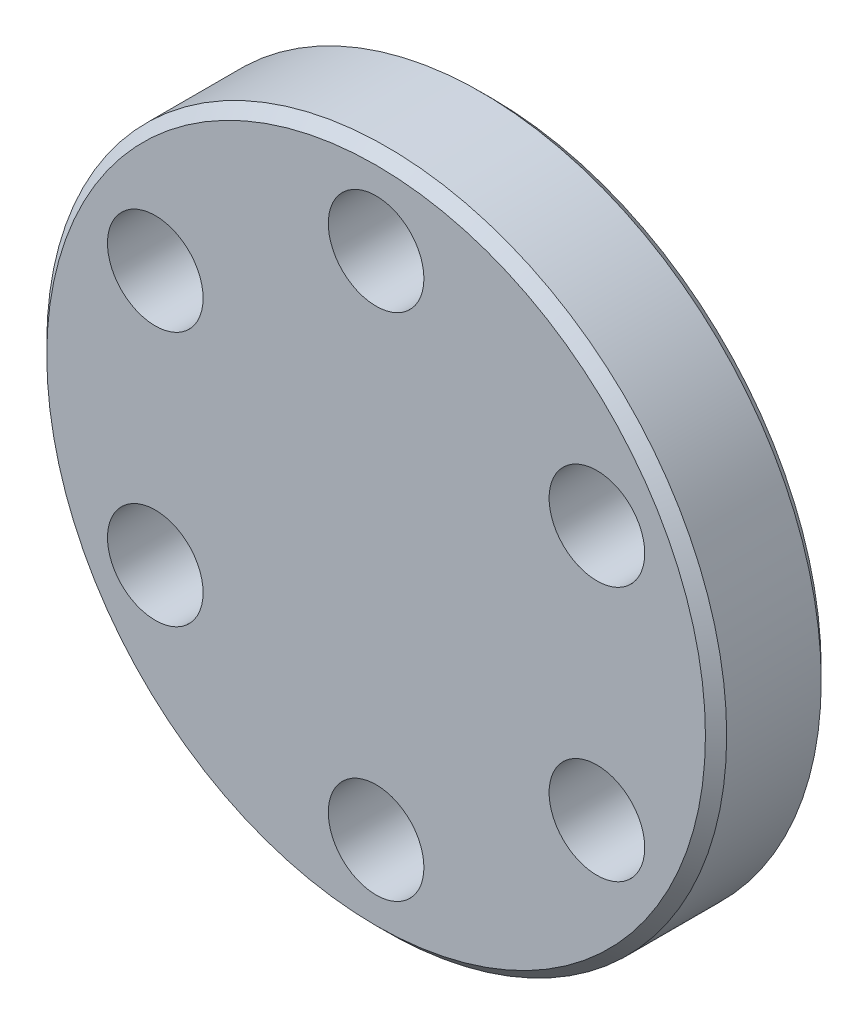
ISO-10303-21;
HEADER;
FILE_DESCRIPTION(('STEP AP214'),'2;1');
FILE_NAME('part.step','',(''),(''),'','','');
FILE_SCHEMA(('AUTOMOTIVE_DESIGN { 1 0 10303 214 1 1 1 1 }'));
ENDSEC;
DATA;
#1=APPLICATION_CONTEXT('core data for automotive mechanical design processes');
#2=APPLICATION_PROTOCOL_DEFINITION('international standard','automotive_design',2000,#1);
#3=PRODUCT_CONTEXT('',#1,'mechanical');
#4=PRODUCT('Part','Part','',(#3));
#5=PRODUCT_RELATED_PRODUCT_CATEGORY('part','',(#4));
#6=PRODUCT_DEFINITION_FORMATION('','',#4);
#7=PRODUCT_DEFINITION_CONTEXT('part definition',#1,'design');
#8=PRODUCT_DEFINITION('design','',#6,#7);
#9=PRODUCT_DEFINITION_SHAPE('','',#8);
#10=(LENGTH_UNIT() NAMED_UNIT(*) SI_UNIT(.MILLI.,.METRE.));
#11=(NAMED_UNIT(*) PLANE_ANGLE_UNIT() SI_UNIT($,.RADIAN.));
#12=(NAMED_UNIT(*) SI_UNIT($,.STERADIAN.) SOLID_ANGLE_UNIT());
#13=UNCERTAINTY_MEASURE_WITH_UNIT(LENGTH_MEASURE(1.E-05),#10,'distance_accuracy_value','');
#14=(GEOMETRIC_REPRESENTATION_CONTEXT(3) GLOBAL_UNCERTAINTY_ASSIGNED_CONTEXT((#13)) GLOBAL_UNIT_ASSIGNED_CONTEXT((#10,
#11,#12)) REPRESENTATION_CONTEXT('',''));
#15=CARTESIAN_POINT('',(0.,0.,0.));
#16=DIRECTION('',(0.,0.,1.));
#17=DIRECTION('',(1.,0.,0.));
#18=AXIS2_PLACEMENT_3D('',#15,#16,#17);
#19=CARTESIAN_POINT('',(0.,0.,2.725));
#20=DIRECTION('',(0.,0.,-1.));
#21=DIRECTION('',(-1.,0.,0.));
#22=AXIS2_PLACEMENT_3D('',#19,#20,#21);
#23=CYLINDRICAL_SURFACE('',#22,16.);
#24=CARTESIAN_POINT('',(0.,0.,-2.225));
#25=DIRECTION('',(0.,0.,1.));
#26=DIRECTION('',(1.,0.,0.));
#27=AXIS2_PLACEMENT_3D('',#24,#25,#26);
#28=CIRCLE('',#27,16.);
#29=CARTESIAN_POINT('',(16.,0.,-2.225));
#30=VERTEX_POINT('',#29);
#31=EDGE_CURVE('E51',#30,#30,#28,.T.);
#32=ORIENTED_EDGE('',*,*,#31,.T.);
#33=EDGE_LOOP('',(#32));
#34=FACE_BOUND('',#33,.T.);
#35=CARTESIAN_POINT('',(0.,0.,2.22499999999999));
#36=DIRECTION('',(0.,0.,1.));
#37=DIRECTION('',(1.,0.,0.));
#38=AXIS2_PLACEMENT_3D('',#35,#36,#37);
#39=CIRCLE('',#38,16.);
#40=CARTESIAN_POINT('',(16.,0.,2.22499999999999));
#41=VERTEX_POINT('',#40);
#42=EDGE_CURVE('E55',#41,#41,#39,.F.);
#43=ORIENTED_EDGE('',*,*,#42,.T.);
#44=EDGE_LOOP('',(#43));
#45=FACE_BOUND('',#44,.T.);
#46=ADVANCED_FACE('F39',(#34,#45),#23,.T.);
#47=CARTESIAN_POINT('',(0.,0.,2.725));
#48=DIRECTION('',(0.,0.,1.));
#49=DIRECTION('',(1.,0.,0.));
#50=AXIS2_PLACEMENT_3D('',#47,#48,#49);
#51=PLANE('',#50);
#52=CARTESIAN_POINT('',(0.,0.,2.725));
#53=DIRECTION('',(0.,0.,1.));
#54=DIRECTION('',(1.,0.,0.));
#55=AXIS2_PLACEMENT_3D('',#52,#53,#54);
#56=CIRCLE('',#55,15.5);
#57=CARTESIAN_POINT('',(15.5,0.,2.725));
#58=VERTEX_POINT('',#57);
#59=EDGE_CURVE('E10',#58,#58,#56,.T.);
#60=ORIENTED_EDGE('',*,*,#59,.T.);
#61=EDGE_LOOP('',(#60));
#62=FACE_BOUND('',#61,.T.);
#63=CARTESIAN_POINT('',(0.,12.,2.725));
#64=DIRECTION('',(0.,0.,1.));
#65=DIRECTION('',(1.,0.,0.));
#66=AXIS2_PLACEMENT_3D('',#63,#64,#65);
#67=CIRCLE('',#66,2.25);
#68=CARTESIAN_POINT('',(2.25,12.,2.725));
#69=VERTEX_POINT('',#68);
#70=EDGE_CURVE('E93',#69,#69,#67,.T.);
#71=ORIENTED_EDGE('',*,*,#70,.F.);
#72=EDGE_LOOP('',(#71));
#73=FACE_BOUND('',#72,.T.);
#74=CARTESIAN_POINT('',(10.3923048454133,5.99999999999998,2.725));
#75=DIRECTION('',(0.,0.,1.));
#76=DIRECTION('',(1.,0.,0.));
#77=AXIS2_PLACEMENT_3D('',#74,#75,#76);
#78=CIRCLE('',#77,2.25);
#79=CARTESIAN_POINT('',(12.6423048454133,5.99999999999998,2.725));
#80=VERTEX_POINT('',#79);
#81=EDGE_CURVE('E87',#80,#80,#78,.T.);
#82=ORIENTED_EDGE('',*,*,#81,.F.);
#83=EDGE_LOOP('',(#82));
#84=FACE_BOUND('',#83,.T.);
#85=CARTESIAN_POINT('',(10.3923048454132,-6.00000000000005,2.725));
#86=DIRECTION('',(0.,0.,1.));
#87=DIRECTION('',(1.,0.,0.));
#88=AXIS2_PLACEMENT_3D('',#85,#86,#87);
#89=CIRCLE('',#88,2.25);
#90=CARTESIAN_POINT('',(12.6423048454132,-6.00000000000005,2.725));
#91=VERTEX_POINT('',#90);
#92=EDGE_CURVE('E81',#91,#91,#89,.T.);
#93=ORIENTED_EDGE('',*,*,#92,.F.);
#94=EDGE_LOOP('',(#93));
#95=FACE_BOUND('',#94,.T.);
#96=CARTESIAN_POINT('',(0.,-12.,2.725));
#97=DIRECTION('',(0.,0.,1.));
#98=DIRECTION('',(1.,0.,0.));
#99=AXIS2_PLACEMENT_3D('',#96,#97,#98);
#100=CIRCLE('',#99,2.25);
#101=CARTESIAN_POINT('',(2.24999999999992,-12.,2.725));
#102=VERTEX_POINT('',#101);
#103=EDGE_CURVE('E75',#102,#102,#100,.T.);
#104=ORIENTED_EDGE('',*,*,#103,.F.);
#105=EDGE_LOOP('',(#104));
#106=FACE_BOUND('',#105,.T.);
#107=CARTESIAN_POINT('',(-10.3923048454133,-5.9999999999999,2.725));
#108=DIRECTION('',(0.,0.,1.));
#109=DIRECTION('',(1.,0.,0.));
#110=AXIS2_PLACEMENT_3D('',#107,#108,#109);
#111=CIRCLE('',#110,2.25);
#112=CARTESIAN_POINT('',(-8.14230484541332,-5.9999999999999,2.725));
#113=VERTEX_POINT('',#112);
#114=EDGE_CURVE('E69',#113,#113,#111,.T.);
#115=ORIENTED_EDGE('',*,*,#114,.F.);
#116=EDGE_LOOP('',(#115));
#117=FACE_BOUND('',#116,.T.);
#118=CARTESIAN_POINT('',(-10.3923048454132,6.00000000000012,2.725));
#119=DIRECTION('',(0.,0.,1.));
#120=DIRECTION('',(1.,0.,0.));
#121=AXIS2_PLACEMENT_3D('',#118,#119,#120);
#122=CIRCLE('',#121,2.25);
#123=CARTESIAN_POINT('',(-8.14230484541319,6.00000000000012,2.725));
#124=VERTEX_POINT('',#123);
#125=EDGE_CURVE('E63',#124,#124,#122,.T.);
#126=ORIENTED_EDGE('',*,*,#125,.F.);
#127=EDGE_LOOP('',(#126));
#128=FACE_BOUND('',#127,.T.);
#129=ADVANCED_FACE('F99',(#62,#73,#84,#95,#106,#117,#128),#51,.T.);
#130=CARTESIAN_POINT('',(0.,0.,-2.725));
#131=DIRECTION('',(0.,0.,1.));
#132=DIRECTION('',(1.,0.,0.));
#133=AXIS2_PLACEMENT_3D('',#130,#131,#132);
#134=PLANE('',#133);
#135=CARTESIAN_POINT('',(0.,0.,-2.725));
#136=DIRECTION('',(0.,0.,1.));
#137=DIRECTION('',(1.,0.,0.));
#138=AXIS2_PLACEMENT_3D('',#135,#136,#137);
#139=CIRCLE('',#138,15.5);
#140=CARTESIAN_POINT('',(15.5,0.,-2.725));
#141=VERTEX_POINT('',#140);
#142=EDGE_CURVE('E47',#141,#141,#139,.F.);
#143=ORIENTED_EDGE('',*,*,#142,.T.);
#144=EDGE_LOOP('',(#143));
#145=FACE_BOUND('',#144,.T.);
#146=CARTESIAN_POINT('',(0.,12.,-2.725));
#147=DIRECTION('',(0.,0.,1.));
#148=DIRECTION('',(1.,0.,0.));
#149=AXIS2_PLACEMENT_3D('',#146,#147,#148);
#150=CIRCLE('',#149,2.25);
#151=CARTESIAN_POINT('',(2.25,12.,-2.725));
#152=VERTEX_POINT('',#151);
#153=EDGE_CURVE('E90',#152,#152,#150,.T.);
#154=ORIENTED_EDGE('',*,*,#153,.T.);
#155=EDGE_LOOP('',(#154));
#156=FACE_BOUND('',#155,.T.);
#157=CARTESIAN_POINT('',(10.3923048454133,5.99999999999998,-2.725));
#158=DIRECTION('',(0.,0.,1.));
#159=DIRECTION('',(1.,0.,0.));
#160=AXIS2_PLACEMENT_3D('',#157,#158,#159);
#161=CIRCLE('',#160,2.25);
#162=CARTESIAN_POINT('',(12.6423048454133,5.99999999999998,-2.725));
#163=VERTEX_POINT('',#162);
#164=EDGE_CURVE('E84',#163,#163,#161,.T.);
#165=ORIENTED_EDGE('',*,*,#164,.T.);
#166=EDGE_LOOP('',(#165));
#167=FACE_BOUND('',#166,.T.);
#168=CARTESIAN_POINT('',(10.3923048454132,-6.00000000000005,-2.725));
#169=DIRECTION('',(0.,0.,1.));
#170=DIRECTION('',(1.,0.,0.));
#171=AXIS2_PLACEMENT_3D('',#168,#169,#170);
#172=CIRCLE('',#171,2.25);
#173=CARTESIAN_POINT('',(12.6423048454132,-6.00000000000005,-2.725));
#174=VERTEX_POINT('',#173);
#175=EDGE_CURVE('E78',#174,#174,#172,.T.);
#176=ORIENTED_EDGE('',*,*,#175,.T.);
#177=EDGE_LOOP('',(#176));
#178=FACE_BOUND('',#177,.T.);
#179=CARTESIAN_POINT('',(0.,-12.,-2.725));
#180=DIRECTION('',(0.,0.,1.));
#181=DIRECTION('',(1.,0.,0.));
#182=AXIS2_PLACEMENT_3D('',#179,#180,#181);
#183=CIRCLE('',#182,2.25);
#184=CARTESIAN_POINT('',(2.24999999999992,-12.,-2.725));
#185=VERTEX_POINT('',#184);
#186=EDGE_CURVE('E72',#185,#185,#183,.T.);
#187=ORIENTED_EDGE('',*,*,#186,.T.);
#188=EDGE_LOOP('',(#187));
#189=FACE_BOUND('',#188,.T.);
#190=CARTESIAN_POINT('',(-10.3923048454133,-5.9999999999999,-2.725));
#191=DIRECTION('',(0.,0.,1.));
#192=DIRECTION('',(1.,0.,0.));
#193=AXIS2_PLACEMENT_3D('',#190,#191,#192);
#194=CIRCLE('',#193,2.25);
#195=CARTESIAN_POINT('',(-8.14230484541332,-5.9999999999999,-2.725));
#196=VERTEX_POINT('',#195);
#197=EDGE_CURVE('E66',#196,#196,#194,.T.);
#198=ORIENTED_EDGE('',*,*,#197,.T.);
#199=EDGE_LOOP('',(#198));
#200=FACE_BOUND('',#199,.T.);
#201=CARTESIAN_POINT('',(-10.3923048454132,6.00000000000012,-2.725));
#202=DIRECTION('',(0.,0.,1.));
#203=DIRECTION('',(1.,0.,0.));
#204=AXIS2_PLACEMENT_3D('',#201,#202,#203);
#205=CIRCLE('',#204,2.25);
#206=CARTESIAN_POINT('',(-8.14230484541319,6.00000000000012,-2.725));
#207=VERTEX_POINT('',#206);
#208=EDGE_CURVE('E60',#207,#207,#205,.T.);
#209=ORIENTED_EDGE('',*,*,#208,.T.);
#210=EDGE_LOOP('',(#209));
#211=FACE_BOUND('',#210,.T.);
#212=ADVANCED_FACE('F102',(#145,#156,#167,#178,#189,#200,#211),#134,.F.);
#213=CARTESIAN_POINT('',(-10.3923048454132,6.00000000000012,2.725));
#214=DIRECTION('',(0.,0.,1.));
#215=DIRECTION('',(1.,0.,0.));
#216=AXIS2_PLACEMENT_3D('',#213,#214,#215);
#217=CYLINDRICAL_SURFACE('',#216,2.25);
#218=ORIENTED_EDGE('',*,*,#208,.F.);
#219=EDGE_LOOP('',(#218));
#220=FACE_BOUND('',#219,.T.);
#221=ORIENTED_EDGE('',*,*,#125,.T.);
#222=EDGE_LOOP('',(#221));
#223=FACE_BOUND('',#222,.T.);
#224=ADVANCED_FACE('F114',(#220,#223),#217,.F.);
#225=CARTESIAN_POINT('',(-10.3923048454133,-5.9999999999999,2.725));
#226=DIRECTION('',(0.,0.,1.));
#227=DIRECTION('',(1.,0.,0.));
#228=AXIS2_PLACEMENT_3D('',#225,#226,#227);
#229=CYLINDRICAL_SURFACE('',#228,2.25);
#230=ORIENTED_EDGE('',*,*,#197,.F.);
#231=EDGE_LOOP('',(#230));
#232=FACE_BOUND('',#231,.T.);
#233=ORIENTED_EDGE('',*,*,#114,.T.);
#234=EDGE_LOOP('',(#233));
#235=FACE_BOUND('',#234,.T.);
#236=ADVANCED_FACE('F116',(#232,#235),#229,.F.);
#237=CARTESIAN_POINT('',(0.,-12.,2.725));
#238=DIRECTION('',(0.,0.,1.));
#239=DIRECTION('',(1.,0.,0.));
#240=AXIS2_PLACEMENT_3D('',#237,#238,#239);
#241=CYLINDRICAL_SURFACE('',#240,2.25);
#242=ORIENTED_EDGE('',*,*,#186,.F.);
#243=EDGE_LOOP('',(#242));
#244=FACE_BOUND('',#243,.T.);
#245=ORIENTED_EDGE('',*,*,#103,.T.);
#246=EDGE_LOOP('',(#245));
#247=FACE_BOUND('',#246,.T.);
#248=ADVANCED_FACE('F122',(#244,#247),#241,.F.);
#249=CARTESIAN_POINT('',(10.3923048454132,-6.00000000000005,2.725));
#250=DIRECTION('',(0.,0.,1.));
#251=DIRECTION('',(1.,0.,0.));
#252=AXIS2_PLACEMENT_3D('',#249,#250,#251);
#253=CYLINDRICAL_SURFACE('',#252,2.25);
#254=ORIENTED_EDGE('',*,*,#175,.F.);
#255=EDGE_LOOP('',(#254));
#256=FACE_BOUND('',#255,.T.);
#257=ORIENTED_EDGE('',*,*,#92,.T.);
#258=EDGE_LOOP('',(#257));
#259=FACE_BOUND('',#258,.T.);
#260=ADVANCED_FACE('F153',(#256,#259),#253,.F.);
#261=CARTESIAN_POINT('',(10.3923048454133,5.99999999999998,2.725));
#262=DIRECTION('',(0.,0.,1.));
#263=DIRECTION('',(1.,0.,0.));
#264=AXIS2_PLACEMENT_3D('',#261,#262,#263);
#265=CYLINDRICAL_SURFACE('',#264,2.25);
#266=ORIENTED_EDGE('',*,*,#164,.F.);
#267=EDGE_LOOP('',(#266));
#268=FACE_BOUND('',#267,.T.);
#269=ORIENTED_EDGE('',*,*,#81,.T.);
#270=EDGE_LOOP('',(#269));
#271=FACE_BOUND('',#270,.T.);
#272=ADVANCED_FACE('F145',(#268,#271),#265,.F.);
#273=CARTESIAN_POINT('',(0.,12.,2.725));
#274=DIRECTION('',(0.,0.,1.));
#275=DIRECTION('',(1.,0.,0.));
#276=AXIS2_PLACEMENT_3D('',#273,#274,#275);
#277=CYLINDRICAL_SURFACE('',#276,2.25);
#278=ORIENTED_EDGE('',*,*,#153,.F.);
#279=EDGE_LOOP('',(#278));
#280=FACE_BOUND('',#279,.T.);
#281=ORIENTED_EDGE('',*,*,#70,.T.);
#282=EDGE_LOOP('',(#281));
#283=FACE_BOUND('',#282,.T.);
#284=ADVANCED_FACE('F97',(#280,#283),#277,.F.);
#285=CARTESIAN_POINT('',(0.,0.,-2.225));
#286=DIRECTION('',(0.,0.,1.));
#287=DIRECTION('',(1.,0.,0.));
#288=AXIS2_PLACEMENT_3D('',#285,#286,#287);
#289=CONICAL_SURFACE('',#288,16.,0.785398163397452);
#290=ORIENTED_EDGE('',*,*,#142,.F.);
#291=EDGE_LOOP('',(#290));
#292=FACE_BOUND('',#291,.T.);
#293=ORIENTED_EDGE('',*,*,#31,.F.);
#294=EDGE_LOOP('',(#293));
#295=FACE_BOUND('',#294,.T.);
#296=ADVANCED_FACE('F136',(#292,#295),#289,.T.);
#297=CARTESIAN_POINT('',(0.,0.,2.725));
#298=DIRECTION('',(0.,0.,-1.));
#299=DIRECTION('',(-1.,0.,0.));
#300=AXIS2_PLACEMENT_3D('',#297,#298,#299);
#301=CONICAL_SURFACE('',#300,15.5,0.785398163397441);
#302=ORIENTED_EDGE('',*,*,#42,.F.);
#303=EDGE_LOOP('',(#302));
#304=FACE_BOUND('',#303,.T.);
#305=ORIENTED_EDGE('',*,*,#59,.F.);
#306=EDGE_LOOP('',(#305));
#307=FACE_BOUND('',#306,.T.);
#308=ADVANCED_FACE('F42',(#304,#307),#301,.T.);
#309=CLOSED_SHELL('',(#46,#129,#212,#224,#236,#248,#260,#272,#284,#296,#308));
#310=MANIFOLD_SOLID_BREP('B2',#309);
#311=ADVANCED_BREP_SHAPE_REPRESENTATION('',(#18,#310),#14);
#312=SHAPE_DEFINITION_REPRESENTATION(#9,#311);
ENDSEC;
END-ISO-10303-21;
